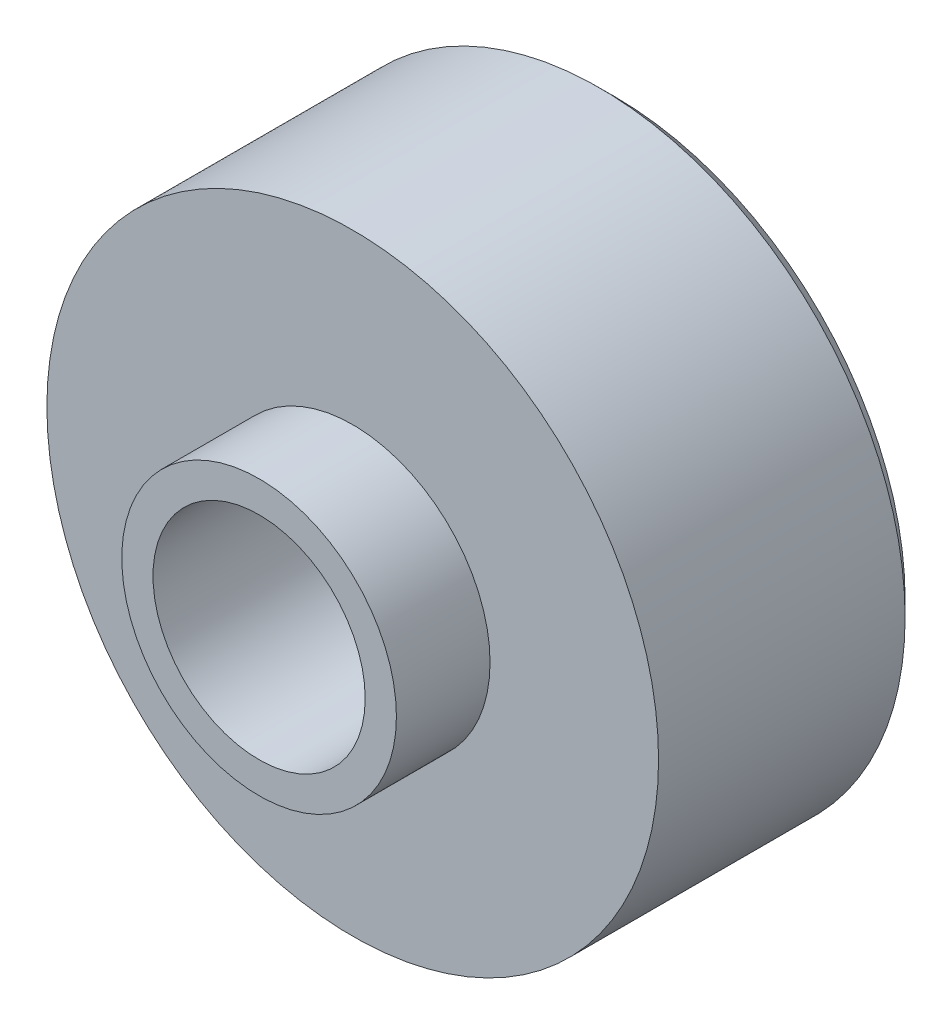
ISO-10303-21;
HEADER;
FILE_DESCRIPTION(('STEP AP214'),'2;1');
FILE_NAME('part.step','',(''),(''),'','','');
FILE_SCHEMA(('AUTOMOTIVE_DESIGN { 1 0 10303 214 1 1 1 1 }'));
ENDSEC;
DATA;
#1=APPLICATION_CONTEXT('core data for automotive mechanical design processes');
#2=APPLICATION_PROTOCOL_DEFINITION('international standard','automotive_design',2000,#1);
#3=PRODUCT_CONTEXT('',#1,'mechanical');
#4=PRODUCT('Part','Part','',(#3));
#5=PRODUCT_RELATED_PRODUCT_CATEGORY('part','',(#4));
#6=PRODUCT_DEFINITION_FORMATION('','',#4);
#7=PRODUCT_DEFINITION_CONTEXT('part definition',#1,'design');
#8=PRODUCT_DEFINITION('design','',#6,#7);
#9=PRODUCT_DEFINITION_SHAPE('','',#8);
#10=(LENGTH_UNIT() NAMED_UNIT(*) SI_UNIT(.MILLI.,.METRE.));
#11=(NAMED_UNIT(*) PLANE_ANGLE_UNIT() SI_UNIT($,.RADIAN.));
#12=(NAMED_UNIT(*) SI_UNIT($,.STERADIAN.) SOLID_ANGLE_UNIT());
#13=UNCERTAINTY_MEASURE_WITH_UNIT(LENGTH_MEASURE(1.E-05),#10,'distance_accuracy_value','');
#14=(GEOMETRIC_REPRESENTATION_CONTEXT(3) GLOBAL_UNCERTAINTY_ASSIGNED_CONTEXT((#13)) GLOBAL_UNIT_ASSIGNED_CONTEXT((#10,
#11,#12)) REPRESENTATION_CONTEXT('',''));
#15=CARTESIAN_POINT('',(0.,0.,0.));
#16=DIRECTION('',(0.,0.,1.));
#17=DIRECTION('',(1.,0.,0.));
#18=AXIS2_PLACEMENT_3D('',#15,#16,#17);
#19=CARTESIAN_POINT('',(0.,0.,4.2));
#20=DIRECTION('',(0.,0.,1.));
#21=DIRECTION('',(1.,0.,0.));
#22=AXIS2_PLACEMENT_3D('',#19,#20,#21);
#23=PLANE('',#22);
#24=CARTESIAN_POINT('',(0.,0.,4.2));
#25=DIRECTION('',(0.,0.,1.));
#26=DIRECTION('',(1.,0.,0.));
#27=AXIS2_PLACEMENT_3D('',#24,#25,#26);
#28=CIRCLE('',#27,4.9);
#29=CARTESIAN_POINT('',(4.9,0.,4.2));
#30=VERTEX_POINT('',#29);
#31=EDGE_CURVE('E64',#30,#30,#28,.T.);
#32=ORIENTED_EDGE('',*,*,#31,.T.);
#33=EDGE_LOOP('',(#32));
#34=FACE_BOUND('',#33,.T.);
#35=CARTESIAN_POINT('',(0.,0.,4.2));
#36=DIRECTION('',(0.,0.,1.));
#37=DIRECTION('',(1.,0.,0.));
#38=AXIS2_PLACEMENT_3D('',#35,#36,#37);
#39=CIRCLE('',#38,2.2);
#40=CARTESIAN_POINT('',(2.2,0.,4.2));
#41=VERTEX_POINT('',#40);
#42=EDGE_CURVE('E69',#41,#41,#39,.T.);
#43=ORIENTED_EDGE('',*,*,#42,.F.);
#44=EDGE_LOOP('',(#43));
#45=FACE_BOUND('',#44,.T.);
#46=ADVANCED_FACE('F39',(#34,#45),#23,.T.);
#47=CARTESIAN_POINT('',(0.,0.,0.));
#48=DIRECTION('',(0.,0.,1.));
#49=DIRECTION('',(1.,0.,0.));
#50=AXIS2_PLACEMENT_3D('',#47,#48,#49);
#51=PLANE('',#50);
#52=CARTESIAN_POINT('',(0.,0.,0.));
#53=DIRECTION('',(0.,0.,1.));
#54=DIRECTION('',(1.,0.,0.));
#55=AXIS2_PLACEMENT_3D('',#52,#53,#54);
#56=CIRCLE('',#55,1.95);
#57=CARTESIAN_POINT('',(1.95,0.,0.));
#58=VERTEX_POINT('',#57);
#59=EDGE_CURVE('E53',#58,#58,#56,.T.);
#60=ORIENTED_EDGE('',*,*,#59,.T.);
#61=EDGE_LOOP('',(#60));
#62=FACE_BOUND('',#61,.T.);
#63=CARTESIAN_POINT('',(0.,0.,0.));
#64=DIRECTION('',(0.,0.,1.));
#65=DIRECTION('',(1.,0.,0.));
#66=AXIS2_PLACEMENT_3D('',#63,#64,#65);
#67=CIRCLE('',#66,4.65);
#68=CARTESIAN_POINT('',(4.65,0.,0.));
#69=VERTEX_POINT('',#68);
#70=EDGE_CURVE('E58',#69,#69,#67,.F.);
#71=ORIENTED_EDGE('',*,*,#70,.T.);
#72=EDGE_LOOP('',(#71));
#73=FACE_BOUND('',#72,.T.);
#74=ADVANCED_FACE('F98',(#62,#73),#51,.F.);
#75=CARTESIAN_POINT('',(0.,0.,4.2));
#76=DIRECTION('',(0.,0.,-1.));
#77=DIRECTION('',(-1.,0.,0.));
#78=AXIS2_PLACEMENT_3D('',#75,#76,#77);
#79=CYLINDRICAL_SURFACE('',#78,4.9);
#80=CARTESIAN_POINT('',(0.,0.,0.250000000000003));
#81=DIRECTION('',(0.,0.,1.));
#82=DIRECTION('',(1.,0.,0.));
#83=AXIS2_PLACEMENT_3D('',#80,#81,#82);
#84=CIRCLE('',#83,4.9);
#85=CARTESIAN_POINT('',(4.9,0.,0.250000000000003));
#86=VERTEX_POINT('',#85);
#87=EDGE_CURVE('E10',#86,#86,#84,.T.);
#88=ORIENTED_EDGE('',*,*,#87,.T.);
#89=EDGE_LOOP('',(#88));
#90=FACE_BOUND('',#89,.T.);
#91=ORIENTED_EDGE('',*,*,#31,.F.);
#92=EDGE_LOOP('',(#91));
#93=FACE_BOUND('',#92,.T.);
#94=ADVANCED_FACE('F95',(#90,#93),#79,.T.);
#95=CARTESIAN_POINT('',(0.,0.,4.2));
#96=DIRECTION('',(0.,0.,-1.));
#97=DIRECTION('',(-1.,0.,0.));
#98=AXIS2_PLACEMENT_3D('',#95,#96,#97);
#99=CYLINDRICAL_SURFACE('',#98,1.7);
#100=CARTESIAN_POINT('',(0.,0.,0.25));
#101=DIRECTION('',(0.,0.,1.));
#102=DIRECTION('',(1.,0.,0.));
#103=AXIS2_PLACEMENT_3D('',#100,#101,#102);
#104=CIRCLE('',#103,1.7);
#105=CARTESIAN_POINT('',(1.7,0.,0.25));
#106=VERTEX_POINT('',#105);
#107=EDGE_CURVE('E48',#106,#106,#104,.F.);
#108=ORIENTED_EDGE('',*,*,#107,.T.);
#109=EDGE_LOOP('',(#108));
#110=FACE_BOUND('',#109,.T.);
#111=CARTESIAN_POINT('',(0.,0.,5.7));
#112=DIRECTION('',(0.,0.,1.));
#113=DIRECTION('',(1.,0.,0.));
#114=AXIS2_PLACEMENT_3D('',#111,#112,#113);
#115=CIRCLE('',#114,1.7);
#116=CARTESIAN_POINT('',(1.7,0.,5.7));
#117=VERTEX_POINT('',#116);
#118=EDGE_CURVE('E73',#117,#117,#115,.T.);
#119=ORIENTED_EDGE('',*,*,#118,.T.);
#120=EDGE_LOOP('',(#119));
#121=FACE_BOUND('',#120,.T.);
#122=ADVANCED_FACE('F81',(#110,#121),#99,.F.);
#123=CARTESIAN_POINT('',(0.,0.,5.7));
#124=DIRECTION('',(0.,0.,1.));
#125=DIRECTION('',(1.,0.,0.));
#126=AXIS2_PLACEMENT_3D('',#123,#124,#125);
#127=PLANE('',#126);
#128=CARTESIAN_POINT('',(0.,0.,5.7));
#129=DIRECTION('',(0.,0.,1.));
#130=DIRECTION('',(1.,0.,0.));
#131=AXIS2_PLACEMENT_3D('',#128,#129,#130);
#132=CIRCLE('',#131,2.2);
#133=CARTESIAN_POINT('',(2.2,0.,5.7));
#134=VERTEX_POINT('',#133);
#135=EDGE_CURVE('E68',#134,#134,#132,.T.);
#136=ORIENTED_EDGE('',*,*,#135,.T.);
#137=EDGE_LOOP('',(#136));
#138=FACE_BOUND('',#137,.T.);
#139=ORIENTED_EDGE('',*,*,#118,.F.);
#140=EDGE_LOOP('',(#139));
#141=FACE_BOUND('',#140,.T.);
#142=ADVANCED_FACE('F83',(#138,#141),#127,.T.);
#143=CARTESIAN_POINT('',(0.,0.,5.7));
#144=DIRECTION('',(0.,0.,-1.));
#145=DIRECTION('',(-1.,0.,0.));
#146=AXIS2_PLACEMENT_3D('',#143,#144,#145);
#147=CYLINDRICAL_SURFACE('',#146,2.2);
#148=ORIENTED_EDGE('',*,*,#135,.F.);
#149=EDGE_LOOP('',(#148));
#150=FACE_BOUND('',#149,.T.);
#151=ORIENTED_EDGE('',*,*,#42,.T.);
#152=EDGE_LOOP('',(#151));
#153=FACE_BOUND('',#152,.T.);
#154=ADVANCED_FACE('F85',(#150,#153),#147,.T.);
#155=CARTESIAN_POINT('',(0.,0.,0.));
#156=DIRECTION('',(0.,0.,-1.));
#157=DIRECTION('',(-1.,0.,0.));
#158=AXIS2_PLACEMENT_3D('',#155,#156,#157);
#159=CONICAL_SURFACE('',#158,1.95,0.785398163397442);
#160=ORIENTED_EDGE('',*,*,#107,.F.);
#161=EDGE_LOOP('',(#160));
#162=FACE_BOUND('',#161,.T.);
#163=ORIENTED_EDGE('',*,*,#59,.F.);
#164=EDGE_LOOP('',(#163));
#165=FACE_BOUND('',#164,.T.);
#166=ADVANCED_FACE('F92',(#162,#165),#159,.F.);
#167=CARTESIAN_POINT('',(0.,0.,0.250000000000003));
#168=DIRECTION('',(0.,0.,1.));
#169=DIRECTION('',(1.,0.,0.));
#170=AXIS2_PLACEMENT_3D('',#167,#168,#169);
#171=CONICAL_SURFACE('',#170,4.9,0.78539816339745);
#172=ORIENTED_EDGE('',*,*,#70,.F.);
#173=EDGE_LOOP('',(#172));
#174=FACE_BOUND('',#173,.T.);
#175=ORIENTED_EDGE('',*,*,#87,.F.);
#176=EDGE_LOOP('',(#175));
#177=FACE_BOUND('',#176,.T.);
#178=ADVANCED_FACE('F42',(#174,#177),#171,.T.);
#179=CLOSED_SHELL('',(#46,#74,#94,#122,#142,#154,#166,#178));
#180=MANIFOLD_SOLID_BREP('B2',#179);
#181=ADVANCED_BREP_SHAPE_REPRESENTATION('',(#18,#180),#14);
#182=SHAPE_DEFINITION_REPRESENTATION(#9,#181);
ENDSEC;
END-ISO-10303-21;
